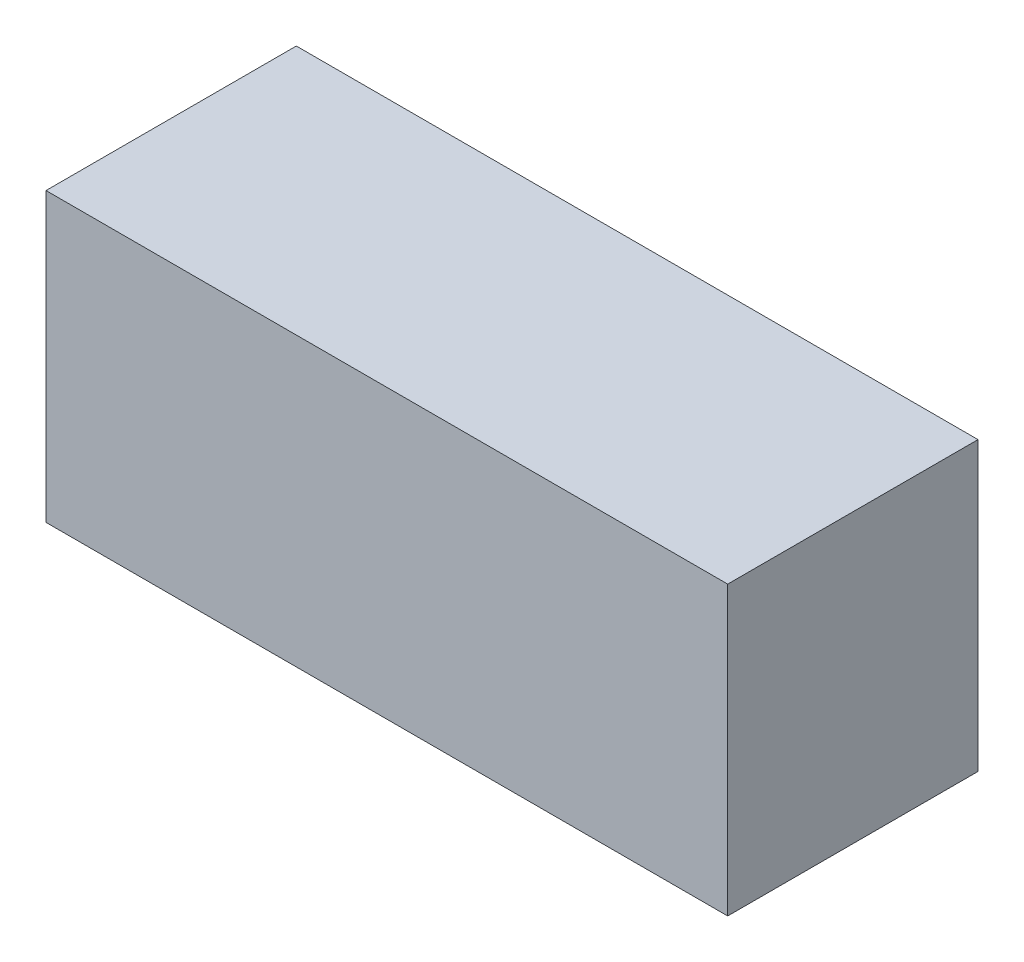
ISO-10303-21;
HEADER;
FILE_DESCRIPTION(('STEP AP214'),'2;1');
FILE_NAME('part.step','',(''),(''),'','','');
FILE_SCHEMA(('AUTOMOTIVE_DESIGN { 1 0 10303 214 1 1 1 1 }'));
ENDSEC;
DATA;
#1=APPLICATION_CONTEXT('core data for automotive mechanical design processes');
#2=APPLICATION_PROTOCOL_DEFINITION('international standard','automotive_design',2000,#1);
#3=PRODUCT_CONTEXT('',#1,'mechanical');
#4=PRODUCT('Part','Part','',(#3));
#5=PRODUCT_RELATED_PRODUCT_CATEGORY('part','',(#4));
#6=PRODUCT_DEFINITION_FORMATION('','',#4);
#7=PRODUCT_DEFINITION_CONTEXT('part definition',#1,'design');
#8=PRODUCT_DEFINITION('design','',#6,#7);
#9=PRODUCT_DEFINITION_SHAPE('','',#8);
#10=(LENGTH_UNIT() NAMED_UNIT(*) SI_UNIT(.MILLI.,.METRE.));
#11=(NAMED_UNIT(*) PLANE_ANGLE_UNIT() SI_UNIT($,.RADIAN.));
#12=(NAMED_UNIT(*) SI_UNIT($,.STERADIAN.) SOLID_ANGLE_UNIT());
#13=UNCERTAINTY_MEASURE_WITH_UNIT(LENGTH_MEASURE(1.E-05),#10,'distance_accuracy_value','');
#14=(GEOMETRIC_REPRESENTATION_CONTEXT(3) GLOBAL_UNCERTAINTY_ASSIGNED_CONTEXT((#13)) GLOBAL_UNIT_ASSIGNED_CONTEXT((#10,
#11,#12)) REPRESENTATION_CONTEXT('',''));
#15=CARTESIAN_POINT('',(0.,0.,0.));
#16=DIRECTION('',(0.,0.,1.));
#17=DIRECTION('',(1.,0.,0.));
#18=AXIS2_PLACEMENT_3D('',#15,#16,#17);
#19=CARTESIAN_POINT('',(0.,0.,0.6096));
#20=DIRECTION('',(0.,0.,1.));
#21=DIRECTION('',(1.,0.,0.));
#22=AXIS2_PLACEMENT_3D('',#19,#20,#21);
#23=PLANE('',#22);
#24=DIRECTION('',(1.,0.,0.));
#25=VECTOR('',#24,1.);
#26=CARTESIAN_POINT('',(-0.83009994,0.3499993,0.6096000000553));
#27=LINE('',#26,#25);
#28=CARTESIAN_POINT('',(-0.83009994,0.3499993,0.6096000000553));
#29=VERTEX_POINT('',#28);
#30=CARTESIAN_POINT('',(0.83009994,0.3499993,0.6096000000553));
#31=VERTEX_POINT('',#30);
#32=EDGE_CURVE('E11',#29,#31,#27,.T.);
#33=ORIENTED_EDGE('',*,*,#32,.F.);
#34=DIRECTION('',(0.,1.,0.));
#35=VECTOR('',#34,1.);
#36=CARTESIAN_POINT('',(-0.83009994,-0.349999300136,0.6096000000553));
#37=LINE('',#36,#35);
#38=CARTESIAN_POINT('',(-0.83009994,-0.349999300136,0.6096000000553));
#39=VERTEX_POINT('',#38);
#40=EDGE_CURVE('E102',#39,#29,#37,.T.);
#41=ORIENTED_EDGE('',*,*,#40,.F.);
#42=DIRECTION('',(-1.,-8.191787398478E-11,0.));
#43=VECTOR('',#42,1.);
#44=CARTESIAN_POINT('',(0.83009994,-0.3499993,0.6096000000553));
#45=LINE('',#44,#43);
#46=CARTESIAN_POINT('',(0.83009994,-0.3499993,0.6096000000553));
#47=VERTEX_POINT('',#46);
#48=EDGE_CURVE('E93',#47,#39,#45,.T.);
#49=ORIENTED_EDGE('',*,*,#48,.F.);
#50=DIRECTION('',(0.,-1.,0.));
#51=VECTOR('',#50,1.);
#52=CARTESIAN_POINT('',(0.83009994,0.3499993,0.6096000000553));
#53=LINE('',#52,#51);
#54=EDGE_CURVE('E69',#31,#47,#53,.T.);
#55=ORIENTED_EDGE('',*,*,#54,.F.);
#56=EDGE_LOOP('',(#33,#41,#49,#55));
#57=FACE_BOUND('',#56,.T.);
#58=ADVANCED_FACE('F18',(#57),#23,.T.);
#59=CARTESIAN_POINT('',(0.83009994,0.3499993,0.));
#60=DIRECTION('',(0.,1.,0.));
#61=DIRECTION('',(1.,0.,0.));
#62=AXIS2_PLACEMENT_3D('',#59,#60,#61);
#63=PLANE('',#62);
#64=ORIENTED_EDGE('',*,*,#32,.T.);
#65=DIRECTION('',(1.640420083087E-10,-3.975284121644E-10,-1.));
#66=VECTOR('',#65,1.);
#67=CARTESIAN_POINT('',(0.83009994,0.3499993,0.6096000000553));
#68=LINE('',#67,#66);
#69=CARTESIAN_POINT('',(0.8300999401,0.3499992997577,0.));
#70=VERTEX_POINT('',#69);
#71=EDGE_CURVE('E28',#31,#70,#68,.T.);
#72=ORIENTED_EDGE('',*,*,#71,.T.);
#73=DIRECTION('',(1.,0.,0.));
#74=VECTOR('',#73,1.);
#75=CARTESIAN_POINT('',(-0.8300999401,0.3499992997577,0.));
#76=LINE('',#75,#74);
#77=CARTESIAN_POINT('',(-0.8300999401,0.3499992997577,0.));
#78=VERTEX_POINT('',#77);
#79=EDGE_CURVE('E65',#78,#70,#76,.T.);
#80=ORIENTED_EDGE('',*,*,#79,.F.);
#81=DIRECTION('',(-1.640420083087E-10,-3.975284121644E-10,-1.));
#82=VECTOR('',#81,1.);
#83=CARTESIAN_POINT('',(-0.83009994,0.3499993,0.6096000000553));
#84=LINE('',#83,#82);
#85=EDGE_CURVE('E99',#29,#78,#84,.T.);
#86=ORIENTED_EDGE('',*,*,#85,.F.);
#87=EDGE_LOOP('',(#64,#72,#80,#86));
#88=FACE_BOUND('',#87,.T.);
#89=ADVANCED_FACE('F63',(#88),#63,.T.);
#90=CARTESIAN_POINT('',(0.83009994,-0.3499993,0.));
#91=DIRECTION('',(1.,0.,0.));
#92=DIRECTION('',(0.,1.,0.));
#93=AXIS2_PLACEMENT_3D('',#90,#91,#92);
#94=PLANE('',#93);
#95=ORIENTED_EDGE('',*,*,#54,.T.);
#96=DIRECTION('',(1.640420083087E-10,3.975284121644E-10,-1.));
#97=VECTOR('',#96,1.);
#98=CARTESIAN_POINT('',(0.83009994,-0.3499993,0.6096000000553));
#99=LINE('',#98,#97);
#100=CARTESIAN_POINT('',(0.8300999401,-0.3499992997577,0.));
#101=VERTEX_POINT('',#100);
#102=EDGE_CURVE('E74',#47,#101,#99,.T.);
#103=ORIENTED_EDGE('',*,*,#102,.T.);
#104=DIRECTION('',(0.,-1.,0.));
#105=VECTOR('',#104,1.);
#106=CARTESIAN_POINT('',(0.8300999401,0.3499992997577,0.));
#107=LINE('',#106,#105);
#108=EDGE_CURVE('E71',#70,#101,#107,.T.);
#109=ORIENTED_EDGE('',*,*,#108,.F.);
#110=ORIENTED_EDGE('',*,*,#71,.F.);
#111=EDGE_LOOP('',(#95,#103,#109,#110));
#112=FACE_BOUND('',#111,.T.);
#113=ADVANCED_FACE('F72',(#112),#94,.T.);
#114=CARTESIAN_POINT('',(-0.83009994,-0.3499993,0.));
#115=DIRECTION('',(0.,-1.,0.));
#116=DIRECTION('',(0.,0.,-1.));
#117=AXIS2_PLACEMENT_3D('',#114,#115,#116);
#118=PLANE('',#117);
#119=ORIENTED_EDGE('',*,*,#48,.T.);
#120=DIRECTION('',(-1.640420083087E-10,3.97528503226E-10,-1.));
#121=VECTOR('',#120,1.);
#122=CARTESIAN_POINT('',(-0.83009994,-0.349999300136,0.6096000000553));
#123=LINE('',#122,#121);
#124=CARTESIAN_POINT('',(-0.8300999401,-0.3499992998937,0.));
#125=VERTEX_POINT('',#124);
#126=EDGE_CURVE('E96',#39,#125,#123,.T.);
#127=ORIENTED_EDGE('',*,*,#126,.T.);
#128=DIRECTION('',(-1.,-8.191780710206E-11,0.));
#129=VECTOR('',#128,1.);
#130=CARTESIAN_POINT('',(0.8300999401,-0.3499992997577,0.));
#131=LINE('',#130,#129);
#132=EDGE_CURVE('E79',#101,#125,#131,.T.);
#133=ORIENTED_EDGE('',*,*,#132,.F.);
#134=ORIENTED_EDGE('',*,*,#102,.F.);
#135=EDGE_LOOP('',(#119,#127,#133,#134));
#136=FACE_BOUND('',#135,.T.);
#137=ADVANCED_FACE('F112',(#136),#118,.T.);
#138=CARTESIAN_POINT('',(-0.83009994,0.3499993,0.));
#139=DIRECTION('',(-1.,0.,0.));
#140=DIRECTION('',(0.,0.,1.));
#141=AXIS2_PLACEMENT_3D('',#138,#139,#140);
#142=PLANE('',#141);
#143=ORIENTED_EDGE('',*,*,#40,.T.);
#144=ORIENTED_EDGE('',*,*,#85,.T.);
#145=DIRECTION('',(0.,1.,0.));
#146=VECTOR('',#145,1.);
#147=CARTESIAN_POINT('',(-0.8300999401,-0.3499992998937,0.));
#148=LINE('',#147,#146);
#149=EDGE_CURVE('E83',#125,#78,#148,.T.);
#150=ORIENTED_EDGE('',*,*,#149,.F.);
#151=ORIENTED_EDGE('',*,*,#126,.F.);
#152=EDGE_LOOP('',(#143,#144,#150,#151));
#153=FACE_BOUND('',#152,.T.);
#154=ADVANCED_FACE('F118',(#153),#142,.T.);
#155=CARTESIAN_POINT('',(0.,0.,0.));
#156=DIRECTION('',(0.,0.,1.));
#157=DIRECTION('',(1.,0.,0.));
#158=AXIS2_PLACEMENT_3D('',#155,#156,#157);
#159=PLANE('',#158);
#160=ORIENTED_EDGE('',*,*,#79,.T.);
#161=ORIENTED_EDGE('',*,*,#108,.T.);
#162=ORIENTED_EDGE('',*,*,#132,.T.);
#163=ORIENTED_EDGE('',*,*,#149,.T.);
#164=EDGE_LOOP('',(#160,#161,#162,#163));
#165=FACE_BOUND('',#164,.T.);
#166=ADVANCED_FACE('F20',(#165),#159,.F.);
#167=CLOSED_SHELL('',(#58,#89,#113,#137,#154,#166));
#168=MANIFOLD_SOLID_BREP('B1',#167);
#169=ADVANCED_BREP_SHAPE_REPRESENTATION('',(#18,#168),#14);
#170=SHAPE_DEFINITION_REPRESENTATION(#9,#169);
ENDSEC;
END-ISO-10303-21;
